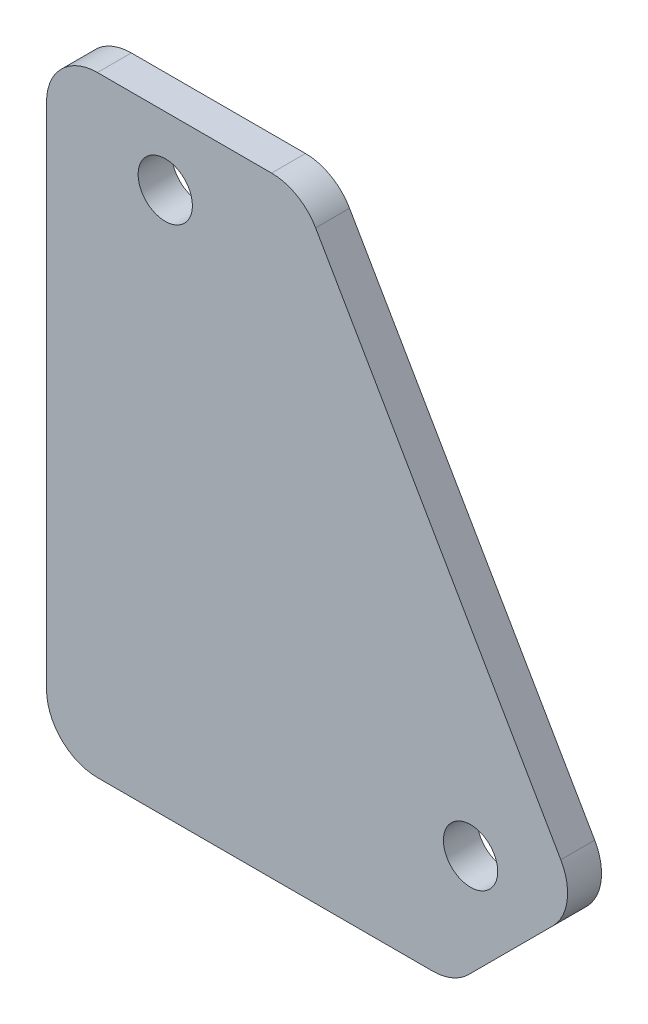
ISO-10303-21;
HEADER;
FILE_DESCRIPTION(('STEP AP214'),'2;1');
FILE_NAME('part.step','',(''),(''),'','','');
FILE_SCHEMA(('AUTOMOTIVE_DESIGN { 1 0 10303 214 1 1 1 1 }'));
ENDSEC;
DATA;
#1=APPLICATION_CONTEXT('core data for automotive mechanical design processes');
#2=APPLICATION_PROTOCOL_DEFINITION('international standard','automotive_design',2000,#1);
#3=PRODUCT_CONTEXT('',#1,'mechanical');
#4=PRODUCT('Part','Part','',(#3));
#5=PRODUCT_RELATED_PRODUCT_CATEGORY('part','',(#4));
#6=PRODUCT_DEFINITION_FORMATION('','',#4);
#7=PRODUCT_DEFINITION_CONTEXT('part definition',#1,'design');
#8=PRODUCT_DEFINITION('design','',#6,#7);
#9=PRODUCT_DEFINITION_SHAPE('','',#8);
#10=(LENGTH_UNIT() NAMED_UNIT(*) SI_UNIT(.MILLI.,.METRE.));
#11=(NAMED_UNIT(*) PLANE_ANGLE_UNIT() SI_UNIT($,.RADIAN.));
#12=(NAMED_UNIT(*) SI_UNIT($,.STERADIAN.) SOLID_ANGLE_UNIT());
#13=UNCERTAINTY_MEASURE_WITH_UNIT(LENGTH_MEASURE(1.E-05),#10,'distance_accuracy_value','');
#14=(GEOMETRIC_REPRESENTATION_CONTEXT(3) GLOBAL_UNCERTAINTY_ASSIGNED_CONTEXT((#13)) GLOBAL_UNIT_ASSIGNED_CONTEXT((#10,
#11,#12)) REPRESENTATION_CONTEXT('',''));
#15=CARTESIAN_POINT('',(0.,0.,0.));
#16=DIRECTION('',(0.,0.,1.));
#17=DIRECTION('',(1.,0.,0.));
#18=AXIS2_PLACEMENT_3D('',#15,#16,#17);
#19=CARTESIAN_POINT('',(61.556188962462,81.9981524696439,10.));
#20=DIRECTION('',(0.,0.,1.));
#21=DIRECTION('',(1.,0.,0.));
#22=AXIS2_PLACEMENT_3D('',#19,#20,#21);
#23=PLANE('',#22);
#24=CARTESIAN_POINT('',(35.,160.,10.));
#25=DIRECTION('',(0.,0.,-1.));
#26=DIRECTION('',(1.,0.,0.));
#27=AXIS2_PLACEMENT_3D('',#24,#25,#26);
#28=CIRCLE('',#27,8.);
#29=CARTESIAN_POINT('',(27.,160.,10.));
#30=VERTEX_POINT('',#29);
#31=EDGE_CURVE('E149',#30,#30,#28,.T.);
#32=ORIENTED_EDGE('',*,*,#31,.T.);
#33=EDGE_LOOP('',(#32));
#34=FACE_BOUND('',#33,.T.);
#35=CARTESIAN_POINT('',(125.,35.,10.));
#36=DIRECTION('',(0.,0.,-1.));
#37=DIRECTION('',(1.,0.,0.));
#38=AXIS2_PLACEMENT_3D('',#35,#36,#37);
#39=CIRCLE('',#38,8.);
#40=CARTESIAN_POINT('',(117.,35.,10.));
#41=VERTEX_POINT('',#40);
#42=EDGE_CURVE('E159',#41,#41,#39,.T.);
#43=ORIENTED_EDGE('',*,*,#42,.T.);
#44=EDGE_LOOP('',(#43));
#45=FACE_BOUND('',#44,.T.);
#46=CARTESIAN_POINT('',(15.,15.,10.));
#47=DIRECTION('',(0.,0.,-1.));
#48=DIRECTION('',(-0.707106781186547,-0.707106781186548,0.));
#49=AXIS2_PLACEMENT_3D('',#46,#47,#48);
#50=CIRCLE('',#49,15.);
#51=CARTESIAN_POINT('',(15.,0.,10.));
#52=VERTEX_POINT('',#51);
#53=CARTESIAN_POINT('',(0.,15.,10.));
#54=VERTEX_POINT('',#53);
#55=EDGE_CURVE('E188',#52,#54,#50,.T.);
#56=ORIENTED_EDGE('',*,*,#55,.F.);
#57=DIRECTION('',(1.,0.,0.));
#58=VECTOR('',#57,1.);
#59=CARTESIAN_POINT('',(0.,0.,10.));
#60=LINE('',#59,#58);
#61=CARTESIAN_POINT('',(113.786796564404,0.,10.));
#62=VERTEX_POINT('',#61);
#63=EDGE_CURVE('E172',#52,#62,#60,.T.);
#64=ORIENTED_EDGE('',*,*,#63,.T.);
#65=CARTESIAN_POINT('',(113.786796564404,15.,10.));
#66=DIRECTION('',(0.,0.,-1.));
#67=DIRECTION('',(0.38268343236509,-0.923879532511287,0.));
#68=AXIS2_PLACEMENT_3D('',#65,#66,#67);
#69=CIRCLE('',#68,15.);
#70=CARTESIAN_POINT('',(124.393398282202,4.39339828220177,10.));
#71=VERTEX_POINT('',#70);
#72=EDGE_CURVE('E196',#71,#62,#69,.T.);
#73=ORIENTED_EDGE('',*,*,#72,.F.);
#74=DIRECTION('',(0.707106781186548,0.707106781186547,0.));
#75=VECTOR('',#74,1.);
#76=CARTESIAN_POINT('',(120.,0.,10.));
#77=LINE('',#76,#75);
#78=CARTESIAN_POINT('',(149.216984102688,29.216984102688,10.));
#79=VERTEX_POINT('',#78);
#80=EDGE_CURVE('E114',#71,#79,#77,.T.);
#81=ORIENTED_EDGE('',*,*,#80,.T.);
#82=CARTESIAN_POINT('',(138.61038238489,39.8235858204863,10.));
#83=DIRECTION('',(0.,0.,-1.));
#84=DIRECTION('',(0.99144486137381,-0.130526192220052,0.));
#85=AXIS2_PLACEMENT_3D('',#82,#83,#84);
#86=CIRCLE('',#85,15.);
#87=CARTESIAN_POINT('',(151.600763441656,47.3235858204863,10.));
#88=VERTEX_POINT('',#87);
#89=EDGE_CURVE('E189',#88,#79,#86,.T.);
#90=ORIENTED_EDGE('',*,*,#89,.F.);
#91=DIRECTION('',(-0.5,0.866025403784439,0.));
#92=VECTOR('',#91,1.);
#93=CARTESIAN_POINT('',(157.355715851499,37.3557158514986,10.));
#94=LINE('',#93,#92);
#95=CARTESIAN_POINT('',(79.3301270189222,172.5,10.));
#96=VERTEX_POINT('',#95);
#97=EDGE_CURVE('E179',#88,#96,#94,.T.);
#98=ORIENTED_EDGE('',*,*,#97,.T.);
#99=CARTESIAN_POINT('',(66.3397459621556,165.,10.));
#100=DIRECTION('',(0.,0.,-1.));
#101=DIRECTION('',(0.5,0.866025403784439,0.));
#102=AXIS2_PLACEMENT_3D('',#99,#100,#101);
#103=CIRCLE('',#102,15.);
#104=CARTESIAN_POINT('',(66.3397459621556,180.,10.));
#105=VERTEX_POINT('',#104);
#106=EDGE_CURVE('E174',#105,#96,#103,.T.);
#107=ORIENTED_EDGE('',*,*,#106,.F.);
#108=DIRECTION('',(-1.,0.,0.));
#109=VECTOR('',#108,1.);
#110=CARTESIAN_POINT('',(75.,180.,10.));
#111=LINE('',#110,#109);
#112=CARTESIAN_POINT('',(15.,180.,10.));
#113=VERTEX_POINT('',#112);
#114=EDGE_CURVE('E204',#105,#113,#111,.T.);
#115=ORIENTED_EDGE('',*,*,#114,.T.);
#116=CARTESIAN_POINT('',(15.,165.,10.));
#117=DIRECTION('',(0.,0.,-1.));
#118=DIRECTION('',(-0.707106781186548,0.707106781186548,0.));
#119=AXIS2_PLACEMENT_3D('',#116,#117,#118);
#120=CIRCLE('',#119,15.);
#121=CARTESIAN_POINT('',(0.,165.,10.));
#122=VERTEX_POINT('',#121);
#123=EDGE_CURVE('E182',#122,#113,#120,.T.);
#124=ORIENTED_EDGE('',*,*,#123,.F.);
#125=DIRECTION('',(0.,-1.,0.));
#126=VECTOR('',#125,1.);
#127=CARTESIAN_POINT('',(0.,180.,10.));
#128=LINE('',#127,#126);
#129=EDGE_CURVE('E11',#122,#54,#128,.T.);
#130=ORIENTED_EDGE('',*,*,#129,.T.);
#131=EDGE_LOOP('',(#56,#64,#73,#81,#90,#98,#107,#115,#124,#130));
#132=FACE_BOUND('',#131,.T.);
#133=ADVANCED_FACE('F17',(#34,#45,#132),#23,.T.);
#134=CARTESIAN_POINT('',(0.,180.,0.));
#135=DIRECTION('',(-1.,0.,0.));
#136=DIRECTION('',(0.,1.,0.));
#137=AXIS2_PLACEMENT_3D('',#134,#135,#136);
#138=PLANE('',#137);
#139=DIRECTION('',(0.,0.,-1.));
#140=VECTOR('',#139,1.);
#141=CARTESIAN_POINT('',(0.,15.,0.));
#142=LINE('',#141,#140);
#143=CARTESIAN_POINT('',(0.,15.,0.));
#144=VERTEX_POINT('',#143);
#145=EDGE_CURVE('E183',#54,#144,#142,.T.);
#146=ORIENTED_EDGE('',*,*,#145,.F.);
#147=ORIENTED_EDGE('',*,*,#129,.F.);
#148=DIRECTION('',(0.,0.,1.));
#149=VECTOR('',#148,1.);
#150=CARTESIAN_POINT('',(0.,165.,0.));
#151=LINE('',#150,#149);
#152=CARTESIAN_POINT('',(0.,165.,0.));
#153=VERTEX_POINT('',#152);
#154=EDGE_CURVE('E28',#153,#122,#151,.T.);
#155=ORIENTED_EDGE('',*,*,#154,.F.);
#156=DIRECTION('',(0.,-1.,0.));
#157=VECTOR('',#156,1.);
#158=CARTESIAN_POINT('',(0.,180.,0.));
#159=LINE('',#158,#157);
#160=EDGE_CURVE('E199',#153,#144,#159,.T.);
#161=ORIENTED_EDGE('',*,*,#160,.T.);
#162=EDGE_LOOP('',(#146,#147,#155,#161));
#163=FACE_BOUND('',#162,.T.);
#164=ADVANCED_FACE('F387',(#163),#138,.T.);
#165=CARTESIAN_POINT('',(15.,165.,0.));
#166=DIRECTION('',(0.,0.,1.));
#167=DIRECTION('',(-0.707106781186548,0.707106781186548,0.));
#168=AXIS2_PLACEMENT_3D('',#165,#166,#167);
#169=CYLINDRICAL_SURFACE('',#168,15.);
#170=ORIENTED_EDGE('',*,*,#123,.T.);
#171=DIRECTION('',(0.,0.,-1.));
#172=VECTOR('',#171,1.);
#173=CARTESIAN_POINT('',(15.,180.,0.));
#174=LINE('',#173,#172);
#175=CARTESIAN_POINT('',(15.,180.,0.));
#176=VERTEX_POINT('',#175);
#177=EDGE_CURVE('E207',#113,#176,#174,.T.);
#178=ORIENTED_EDGE('',*,*,#177,.T.);
#179=CARTESIAN_POINT('',(15.,165.,0.));
#180=DIRECTION('',(0.,0.,1.));
#181=DIRECTION('',(-0.707106781186548,0.707106781186548,0.));
#182=AXIS2_PLACEMENT_3D('',#179,#180,#181);
#183=CIRCLE('',#182,15.);
#184=EDGE_CURVE('E235',#176,#153,#183,.T.);
#185=ORIENTED_EDGE('',*,*,#184,.T.);
#186=ORIENTED_EDGE('',*,*,#154,.T.);
#187=EDGE_LOOP('',(#170,#178,#185,#186));
#188=FACE_BOUND('',#187,.T.);
#189=ADVANCED_FACE('F213',(#188),#169,.T.);
#190=CARTESIAN_POINT('',(75.,180.,0.));
#191=DIRECTION('',(0.,1.,0.));
#192=DIRECTION('',(1.,0.,0.));
#193=AXIS2_PLACEMENT_3D('',#190,#191,#192);
#194=PLANE('',#193);
#195=DIRECTION('',(0.,0.,1.));
#196=VECTOR('',#195,1.);
#197=CARTESIAN_POINT('',(66.3397459621556,180.,0.));
#198=LINE('',#197,#196);
#199=CARTESIAN_POINT('',(66.3397459621556,180.,0.));
#200=VERTEX_POINT('',#199);
#201=EDGE_CURVE('E178',#200,#105,#198,.T.);
#202=ORIENTED_EDGE('',*,*,#201,.F.);
#203=DIRECTION('',(-1.,0.,0.));
#204=VECTOR('',#203,1.);
#205=CARTESIAN_POINT('',(75.,180.,0.));
#206=LINE('',#205,#204);
#207=EDGE_CURVE('E225',#200,#176,#206,.T.);
#208=ORIENTED_EDGE('',*,*,#207,.T.);
#209=ORIENTED_EDGE('',*,*,#177,.F.);
#210=ORIENTED_EDGE('',*,*,#114,.F.);
#211=EDGE_LOOP('',(#202,#208,#209,#210));
#212=FACE_BOUND('',#211,.T.);
#213=ADVANCED_FACE('F223',(#212),#194,.T.);
#214=CARTESIAN_POINT('',(66.3397459621556,165.,0.));
#215=DIRECTION('',(0.,0.,1.));
#216=DIRECTION('',(0.5,0.866025403784439,0.));
#217=AXIS2_PLACEMENT_3D('',#214,#215,#216);
#218=CYLINDRICAL_SURFACE('',#217,15.);
#219=ORIENTED_EDGE('',*,*,#106,.T.);
#220=DIRECTION('',(0.,0.,-1.));
#221=VECTOR('',#220,1.);
#222=CARTESIAN_POINT('',(79.3301270189222,172.5,0.));
#223=LINE('',#222,#221);
#224=CARTESIAN_POINT('',(79.3301270189222,172.5,0.));
#225=VERTEX_POINT('',#224);
#226=EDGE_CURVE('E238',#96,#225,#223,.T.);
#227=ORIENTED_EDGE('',*,*,#226,.T.);
#228=CARTESIAN_POINT('',(66.3397459621556,165.,0.));
#229=DIRECTION('',(0.,0.,1.));
#230=DIRECTION('',(0.5,0.866025403784439,0.));
#231=AXIS2_PLACEMENT_3D('',#228,#229,#230);
#232=CIRCLE('',#231,15.);
#233=EDGE_CURVE('E243',#225,#200,#232,.T.);
#234=ORIENTED_EDGE('',*,*,#233,.T.);
#235=ORIENTED_EDGE('',*,*,#201,.T.);
#236=EDGE_LOOP('',(#219,#227,#234,#235));
#237=FACE_BOUND('',#236,.T.);
#238=ADVANCED_FACE('F270',(#237),#218,.T.);
#239=CARTESIAN_POINT('',(157.355715851499,37.3557158514986,0.));
#240=DIRECTION('',(0.866025403784439,0.5,0.));
#241=DIRECTION('',(0.,0.,-1.));
#242=AXIS2_PLACEMENT_3D('',#239,#240,#241);
#243=PLANE('',#242);
#244=DIRECTION('',(0.,0.,1.));
#245=VECTOR('',#244,1.);
#246=CARTESIAN_POINT('',(151.600763441656,47.3235858204863,0.));
#247=LINE('',#246,#245);
#248=CARTESIAN_POINT('',(151.600763441656,47.3235858204863,0.));
#249=VERTEX_POINT('',#248);
#250=EDGE_CURVE('E192',#249,#88,#247,.T.);
#251=ORIENTED_EDGE('',*,*,#250,.F.);
#252=DIRECTION('',(-0.5,0.866025403784439,0.));
#253=VECTOR('',#252,1.);
#254=CARTESIAN_POINT('',(157.355715851499,37.3557158514986,0.));
#255=LINE('',#254,#253);
#256=EDGE_CURVE('E247',#249,#225,#255,.T.);
#257=ORIENTED_EDGE('',*,*,#256,.T.);
#258=ORIENTED_EDGE('',*,*,#226,.F.);
#259=ORIENTED_EDGE('',*,*,#97,.F.);
#260=EDGE_LOOP('',(#251,#257,#258,#259));
#261=FACE_BOUND('',#260,.T.);
#262=ADVANCED_FACE('F266',(#261),#243,.T.);
#263=CARTESIAN_POINT('',(138.61038238489,39.8235858204863,0.));
#264=DIRECTION('',(0.,0.,1.));
#265=DIRECTION('',(0.99144486137381,-0.130526192220052,0.));
#266=AXIS2_PLACEMENT_3D('',#263,#264,#265);
#267=CYLINDRICAL_SURFACE('',#266,15.);
#268=ORIENTED_EDGE('',*,*,#89,.T.);
#269=DIRECTION('',(0.,0.,-1.));
#270=VECTOR('',#269,1.);
#271=CARTESIAN_POINT('',(149.216984102688,29.216984102688,0.));
#272=LINE('',#271,#270);
#273=CARTESIAN_POINT('',(149.216984102688,29.216984102688,0.));
#274=VERTEX_POINT('',#273);
#275=EDGE_CURVE('E203',#79,#274,#272,.T.);
#276=ORIENTED_EDGE('',*,*,#275,.T.);
#277=CARTESIAN_POINT('',(138.61038238489,39.8235858204863,0.));
#278=DIRECTION('',(0.,0.,1.));
#279=DIRECTION('',(0.99144486137381,-0.130526192220052,0.));
#280=AXIS2_PLACEMENT_3D('',#277,#278,#279);
#281=CIRCLE('',#280,15.);
#282=EDGE_CURVE('E252',#274,#249,#281,.T.);
#283=ORIENTED_EDGE('',*,*,#282,.T.);
#284=ORIENTED_EDGE('',*,*,#250,.T.);
#285=EDGE_LOOP('',(#268,#276,#283,#284));
#286=FACE_BOUND('',#285,.T.);
#287=ADVANCED_FACE('F396',(#286),#267,.T.);
#288=CARTESIAN_POINT('',(120.,0.,0.));
#289=DIRECTION('',(0.707106781186547,-0.707106781186548,0.));
#290=DIRECTION('',(0.,0.,-1.));
#291=AXIS2_PLACEMENT_3D('',#288,#289,#290);
#292=PLANE('',#291);
#293=DIRECTION('',(0.,0.,1.));
#294=VECTOR('',#293,1.);
#295=CARTESIAN_POINT('',(124.393398282202,4.39339828220177,0.));
#296=LINE('',#295,#294);
#297=CARTESIAN_POINT('',(124.393398282202,4.39339828220177,0.));
#298=VERTEX_POINT('',#297);
#299=EDGE_CURVE('E120',#298,#71,#296,.T.);
#300=ORIENTED_EDGE('',*,*,#299,.F.);
#301=DIRECTION('',(0.707106781186548,0.707106781186547,0.));
#302=VECTOR('',#301,1.);
#303=CARTESIAN_POINT('',(120.,0.,0.));
#304=LINE('',#303,#302);
#305=EDGE_CURVE('E21',#298,#274,#304,.T.);
#306=ORIENTED_EDGE('',*,*,#305,.T.);
#307=ORIENTED_EDGE('',*,*,#275,.F.);
#308=ORIENTED_EDGE('',*,*,#80,.F.);
#309=EDGE_LOOP('',(#300,#306,#307,#308));
#310=FACE_BOUND('',#309,.T.);
#311=ADVANCED_FACE('F376',(#310),#292,.T.);
#312=CARTESIAN_POINT('',(113.786796564404,15.,0.));
#313=DIRECTION('',(0.,0.,1.));
#314=DIRECTION('',(0.38268343236509,-0.923879532511287,0.));
#315=AXIS2_PLACEMENT_3D('',#312,#313,#314);
#316=CYLINDRICAL_SURFACE('',#315,15.);
#317=ORIENTED_EDGE('',*,*,#72,.T.);
#318=DIRECTION('',(0.,0.,-1.));
#319=VECTOR('',#318,1.);
#320=CARTESIAN_POINT('',(113.786796564404,0.,0.));
#321=LINE('',#320,#319);
#322=CARTESIAN_POINT('',(113.786796564404,0.,0.));
#323=VERTEX_POINT('',#322);
#324=EDGE_CURVE('E168',#62,#323,#321,.T.);
#325=ORIENTED_EDGE('',*,*,#324,.T.);
#326=CARTESIAN_POINT('',(113.786796564404,15.,0.));
#327=DIRECTION('',(0.,0.,1.));
#328=DIRECTION('',(0.38268343236509,-0.923879532511287,0.));
#329=AXIS2_PLACEMENT_3D('',#326,#327,#328);
#330=CIRCLE('',#329,15.);
#331=EDGE_CURVE('E193',#323,#298,#330,.T.);
#332=ORIENTED_EDGE('',*,*,#331,.T.);
#333=ORIENTED_EDGE('',*,*,#299,.T.);
#334=EDGE_LOOP('',(#317,#325,#332,#333));
#335=FACE_BOUND('',#334,.T.);
#336=ADVANCED_FACE('F371',(#335),#316,.T.);
#337=CARTESIAN_POINT('',(61.556188962462,81.9981524696439,0.));
#338=DIRECTION('',(0.,0.,1.));
#339=DIRECTION('',(1.,0.,0.));
#340=AXIS2_PLACEMENT_3D('',#337,#338,#339);
#341=PLANE('',#340);
#342=CARTESIAN_POINT('',(35.,160.,0.));
#343=DIRECTION('',(0.,0.,1.));
#344=DIRECTION('',(1.,0.,0.));
#345=AXIS2_PLACEMENT_3D('',#342,#343,#344);
#346=CIRCLE('',#345,8.);
#347=CARTESIAN_POINT('',(27.,160.,0.));
#348=VERTEX_POINT('',#347);
#349=EDGE_CURVE('E167',#348,#348,#346,.T.);
#350=ORIENTED_EDGE('',*,*,#349,.T.);
#351=EDGE_LOOP('',(#350));
#352=FACE_BOUND('',#351,.T.);
#353=CARTESIAN_POINT('',(125.,35.,0.));
#354=DIRECTION('',(0.,0.,1.));
#355=DIRECTION('',(1.,0.,0.));
#356=AXIS2_PLACEMENT_3D('',#353,#354,#355);
#357=CIRCLE('',#356,8.);
#358=CARTESIAN_POINT('',(117.,35.,0.));
#359=VERTEX_POINT('',#358);
#360=EDGE_CURVE('E146',#359,#359,#357,.T.);
#361=ORIENTED_EDGE('',*,*,#360,.T.);
#362=EDGE_LOOP('',(#361));
#363=FACE_BOUND('',#362,.T.);
#364=CARTESIAN_POINT('',(15.,15.,0.));
#365=DIRECTION('',(0.,0.,1.));
#366=DIRECTION('',(-0.707106781186547,-0.707106781186548,0.));
#367=AXIS2_PLACEMENT_3D('',#364,#365,#366);
#368=CIRCLE('',#367,15.);
#369=CARTESIAN_POINT('',(15.,0.,0.));
#370=VERTEX_POINT('',#369);
#371=EDGE_CURVE('E187',#144,#370,#368,.T.);
#372=ORIENTED_EDGE('',*,*,#371,.F.);
#373=ORIENTED_EDGE('',*,*,#160,.F.);
#374=ORIENTED_EDGE('',*,*,#184,.F.);
#375=ORIENTED_EDGE('',*,*,#207,.F.);
#376=ORIENTED_EDGE('',*,*,#233,.F.);
#377=ORIENTED_EDGE('',*,*,#256,.F.);
#378=ORIENTED_EDGE('',*,*,#282,.F.);
#379=ORIENTED_EDGE('',*,*,#305,.F.);
#380=ORIENTED_EDGE('',*,*,#331,.F.);
#381=DIRECTION('',(1.,0.,0.));
#382=VECTOR('',#381,1.);
#383=CARTESIAN_POINT('',(0.,0.,0.));
#384=LINE('',#383,#382);
#385=EDGE_CURVE('E173',#370,#323,#384,.T.);
#386=ORIENTED_EDGE('',*,*,#385,.F.);
#387=EDGE_LOOP('',(#372,#373,#374,#375,#376,#377,#378,#379,#380,#386));
#388=FACE_BOUND('',#387,.T.);
#389=ADVANCED_FACE('F19',(#352,#363,#388),#341,.F.);
#390=CARTESIAN_POINT('',(0.,0.,0.));
#391=DIRECTION('',(0.,-1.,0.));
#392=DIRECTION('',(0.,0.,-1.));
#393=AXIS2_PLACEMENT_3D('',#390,#391,#392);
#394=PLANE('',#393);
#395=DIRECTION('',(0.,0.,1.));
#396=VECTOR('',#395,1.);
#397=CARTESIAN_POINT('',(15.,0.,0.));
#398=LINE('',#397,#396);
#399=EDGE_CURVE('E248',#370,#52,#398,.T.);
#400=ORIENTED_EDGE('',*,*,#399,.F.);
#401=ORIENTED_EDGE('',*,*,#385,.T.);
#402=ORIENTED_EDGE('',*,*,#324,.F.);
#403=ORIENTED_EDGE('',*,*,#63,.F.);
#404=EDGE_LOOP('',(#400,#401,#402,#403));
#405=FACE_BOUND('',#404,.T.);
#406=ADVANCED_FACE('F426',(#405),#394,.T.);
#407=CARTESIAN_POINT('',(15.,15.,0.));
#408=DIRECTION('',(0.,0.,1.));
#409=DIRECTION('',(-0.707106781186547,-0.707106781186548,0.));
#410=AXIS2_PLACEMENT_3D('',#407,#408,#409);
#411=CYLINDRICAL_SURFACE('',#410,15.);
#412=ORIENTED_EDGE('',*,*,#55,.T.);
#413=ORIENTED_EDGE('',*,*,#145,.T.);
#414=ORIENTED_EDGE('',*,*,#371,.T.);
#415=ORIENTED_EDGE('',*,*,#399,.T.);
#416=EDGE_LOOP('',(#412,#413,#414,#415));
#417=FACE_BOUND('',#416,.T.);
#418=ADVANCED_FACE('F365',(#417),#411,.T.);
#419=CARTESIAN_POINT('',(35.,160.,-226.846257256542));
#420=DIRECTION('',(0.,0.,1.));
#421=DIRECTION('',(1.,0.,0.));
#422=AXIS2_PLACEMENT_3D('',#419,#420,#421);
#423=CYLINDRICAL_SURFACE('',#422,8.);
#424=ORIENTED_EDGE('',*,*,#31,.F.);
#425=DIRECTION('',(0.,0.,-1.));
#426=VECTOR('',#425,1.);
#427=CARTESIAN_POINT('',(27.,160.,-226.846257256542));
#428=LINE('',#427,#426);
#429=EDGE_CURVE('E157',#30,#348,#428,.T.);
#430=ORIENTED_EDGE('',*,*,#429,.T.);
#431=ORIENTED_EDGE('',*,*,#349,.F.);
#432=ORIENTED_EDGE('',*,*,#429,.F.);
#433=EDGE_LOOP('',(#424,#430,#431,#432));
#434=FACE_BOUND('',#433,.T.);
#435=ADVANCED_FACE('F357',(#434),#423,.F.);
#436=CARTESIAN_POINT('',(125.,35.,-226.846257256542));
#437=DIRECTION('',(0.,0.,1.));
#438=DIRECTION('',(1.,0.,0.));
#439=AXIS2_PLACEMENT_3D('',#436,#437,#438);
#440=CYLINDRICAL_SURFACE('',#439,8.);
#441=ORIENTED_EDGE('',*,*,#42,.F.);
#442=DIRECTION('',(0.,0.,-1.));
#443=VECTOR('',#442,1.);
#444=CARTESIAN_POINT('',(117.,35.,-226.846257256542));
#445=LINE('',#444,#443);
#446=EDGE_CURVE('E140',#41,#359,#445,.T.);
#447=ORIENTED_EDGE('',*,*,#446,.T.);
#448=ORIENTED_EDGE('',*,*,#360,.F.);
#449=ORIENTED_EDGE('',*,*,#446,.F.);
#450=EDGE_LOOP('',(#441,#447,#448,#449));
#451=FACE_BOUND('',#450,.T.);
#452=ADVANCED_FACE('F352',(#451),#440,.F.);
#453=CLOSED_SHELL('',(#133,#164,#189,#213,#238,#262,#287,#311,#336,#389,#406,#418,#435,#452));
#454=MANIFOLD_SOLID_BREP('B1',#453);
#455=ADVANCED_BREP_SHAPE_REPRESENTATION('',(#18,#454),#14);
#456=SHAPE_DEFINITION_REPRESENTATION(#9,#455);
ENDSEC;
END-ISO-10303-21;
